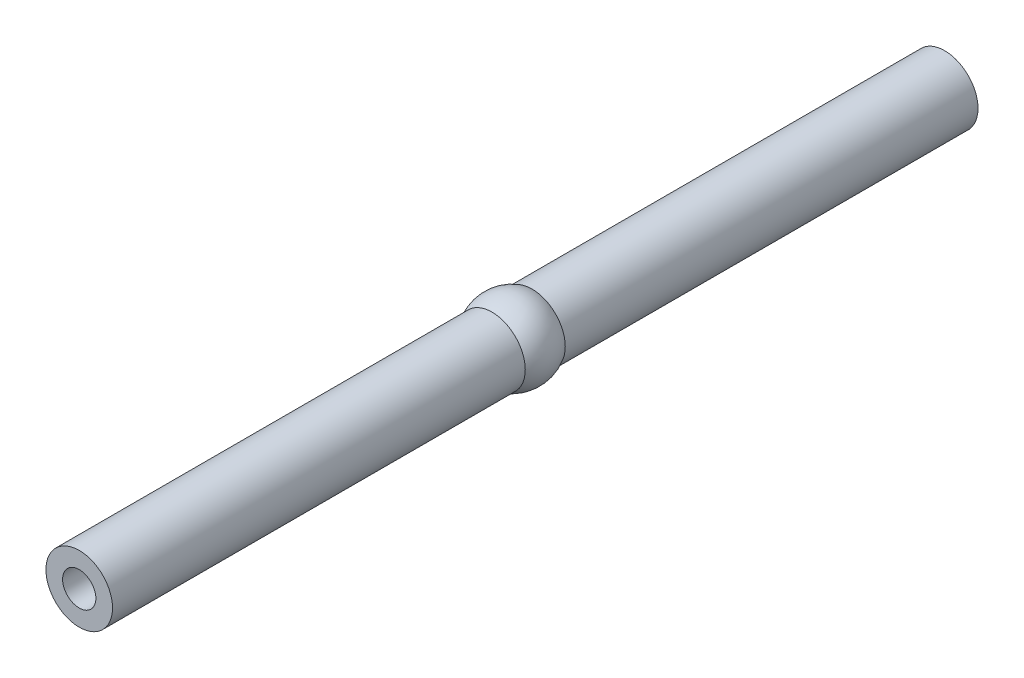
ISO-10303-21;
HEADER;
FILE_DESCRIPTION(('STEP AP214'),'2;1');
FILE_NAME('part.step','',(''),(''),'','','');
FILE_SCHEMA(('AUTOMOTIVE_DESIGN { 1 0 10303 214 1 1 1 1 }'));
ENDSEC;
DATA;
#1=APPLICATION_CONTEXT('core data for automotive mechanical design processes');
#2=APPLICATION_PROTOCOL_DEFINITION('international standard','automotive_design',2000,#1);
#3=PRODUCT_CONTEXT('',#1,'mechanical');
#4=PRODUCT('Part','Part','',(#3));
#5=PRODUCT_RELATED_PRODUCT_CATEGORY('part','',(#4));
#6=PRODUCT_DEFINITION_FORMATION('','',#4);
#7=PRODUCT_DEFINITION_CONTEXT('part definition',#1,'design');
#8=PRODUCT_DEFINITION('design','',#6,#7);
#9=PRODUCT_DEFINITION_SHAPE('','',#8);
#10=(LENGTH_UNIT() NAMED_UNIT(*) SI_UNIT(.MILLI.,.METRE.));
#11=(NAMED_UNIT(*) PLANE_ANGLE_UNIT() SI_UNIT($,.RADIAN.));
#12=(NAMED_UNIT(*) SI_UNIT($,.STERADIAN.) SOLID_ANGLE_UNIT());
#13=UNCERTAINTY_MEASURE_WITH_UNIT(LENGTH_MEASURE(1.E-05),#10,'distance_accuracy_value','');
#14=(GEOMETRIC_REPRESENTATION_CONTEXT(3) GLOBAL_UNCERTAINTY_ASSIGNED_CONTEXT((#13)) GLOBAL_UNIT_ASSIGNED_CONTEXT((#10,
#11,#12)) REPRESENTATION_CONTEXT('',''));
#15=CARTESIAN_POINT('',(0.,0.,0.));
#16=DIRECTION('',(0.,0.,1.));
#17=DIRECTION('',(1.,0.,0.));
#18=AXIS2_PLACEMENT_3D('',#15,#16,#17);
#19=CARTESIAN_POINT('',(0.,0.,39.));
#20=DIRECTION('',(0.,0.,-1.));
#21=DIRECTION('',(-1.,0.,0.));
#22=AXIS2_PLACEMENT_3D('',#19,#20,#21);
#23=CYLINDRICAL_SURFACE('',#22,3.);
#24=CARTESIAN_POINT('',(0.,0.,-39.));
#25=DIRECTION('',(0.,0.,1.));
#26=DIRECTION('',(1.,0.,0.));
#27=AXIS2_PLACEMENT_3D('',#24,#25,#26);
#28=CIRCLE('',#27,3.);
#29=CARTESIAN_POINT('',(3.,0.,-39.));
#30=VERTEX_POINT('',#29);
#31=EDGE_CURVE('E47',#30,#30,#28,.T.);
#32=ORIENTED_EDGE('',*,*,#31,.T.);
#33=EDGE_LOOP('',(#32));
#34=FACE_BOUND('',#33,.T.);
#35=CARTESIAN_POINT('',(0.,0.,-1.802775637732));
#36=DIRECTION('',(0.,0.,1.));
#37=DIRECTION('',(1.,0.,0.));
#38=AXIS2_PLACEMENT_3D('',#35,#36,#37);
#39=CIRCLE('',#38,3.);
#40=CARTESIAN_POINT('',(3.,0.,-1.802775637732));
#41=VERTEX_POINT('',#40);
#42=EDGE_CURVE('E10',#41,#41,#39,.T.);
#43=ORIENTED_EDGE('',*,*,#42,.F.);
#44=EDGE_LOOP('',(#43));
#45=FACE_BOUND('',#44,.T.);
#46=ADVANCED_FACE('F33',(#34,#45),#23,.T.);
#47=CARTESIAN_POINT('',(0.,0.,-39.));
#48=DIRECTION('',(0.,0.,1.));
#49=DIRECTION('',(1.,0.,0.));
#50=AXIS2_PLACEMENT_3D('',#47,#48,#49);
#51=PLANE('',#50);
#52=ORIENTED_EDGE('',*,*,#31,.F.);
#53=EDGE_LOOP('',(#52));
#54=FACE_BOUND('',#53,.T.);
#55=CARTESIAN_POINT('',(0.,0.,-39.));
#56=DIRECTION('',(0.,0.,1.));
#57=DIRECTION('',(1.,0.,0.));
#58=AXIS2_PLACEMENT_3D('',#55,#56,#57);
#59=CIRCLE('',#58,1.5);
#60=CARTESIAN_POINT('',(1.5,0.,-39.));
#61=VERTEX_POINT('',#60);
#62=EDGE_CURVE('E61',#61,#61,#59,.T.);
#63=ORIENTED_EDGE('',*,*,#62,.T.);
#64=EDGE_LOOP('',(#63));
#65=FACE_BOUND('',#64,.T.);
#66=ADVANCED_FACE('F65',(#54,#65),#51,.F.);
#67=CARTESIAN_POINT('',(0.,0.,-29.));
#68=DIRECTION('',(0.,0.,-1.));
#69=DIRECTION('',(-1.,0.,0.));
#70=AXIS2_PLACEMENT_3D('',#67,#68,#69);
#71=CYLINDRICAL_SURFACE('',#70,1.5);
#72=CARTESIAN_POINT('',(0.,0.,-29.));
#73=DIRECTION('',(0.,0.,1.));
#74=DIRECTION('',(1.,0.,0.));
#75=AXIS2_PLACEMENT_3D('',#72,#73,#74);
#76=CIRCLE('',#75,1.5);
#77=CARTESIAN_POINT('',(1.5,0.,-29.));
#78=VERTEX_POINT('',#77);
#79=EDGE_CURVE('E58',#78,#78,#76,.T.);
#80=ORIENTED_EDGE('',*,*,#79,.T.);
#81=EDGE_LOOP('',(#80));
#82=FACE_BOUND('',#81,.T.);
#83=ORIENTED_EDGE('',*,*,#62,.F.);
#84=EDGE_LOOP('',(#83));
#85=FACE_BOUND('',#84,.T.);
#86=ADVANCED_FACE('F67',(#82,#85),#71,.F.);
#87=CARTESIAN_POINT('',(0.,0.,-29.));
#88=DIRECTION('',(0.,0.,-1.));
#89=DIRECTION('',(1.,0.,0.));
#90=AXIS2_PLACEMENT_3D('',#87,#88,#89);
#91=PLANE('',#90);
#92=ORIENTED_EDGE('',*,*,#79,.F.);
#93=EDGE_LOOP('',(#92));
#94=FACE_BOUND('',#93,.T.);
#95=ADVANCED_FACE('F69',(#94),#91,.T.);
#96=CARTESIAN_POINT('',(0.,0.,0.));
#97=DIRECTION('',(0.,0.,-1.));
#98=DIRECTION('',(1.,0.,0.));
#99=AXIS2_PLACEMENT_3D('',#96,#97,#98);
#100=SPHERICAL_SURFACE('',#99,3.5);
#101=CARTESIAN_POINT('',(0.,0.,1.802775637732));
#102=DIRECTION('',(0.,0.,-1.));
#103=DIRECTION('',(-1.,0.,0.));
#104=AXIS2_PLACEMENT_3D('',#101,#102,#103);
#105=CIRCLE('',#104,3.);
#106=CARTESIAN_POINT('',(3.,0.,1.802775637732));
#107=VERTEX_POINT('',#106);
#108=EDGE_CURVE('E39',#107,#107,#105,.T.);
#109=CARTESIAN_POINT('',(3.,0.,1.802775637732));
#110=CARTESIAN_POINT('',(3.02032276109282,0.,1.76895705072467));
#111=CARTESIAN_POINT('',(3.0400731999107,0.,1.73479455955507));
#112=CARTESIAN_POINT('',(3.0784078982649,0.,1.66582142159716));
#113=CARTESIAN_POINT('',(3.09699215780121,0.,1.63101077480884));
#114=CARTESIAN_POINT('',(3.13297296286061,0.,1.56078097831934));
#115=CARTESIAN_POINT('',(3.1503695083837,0.,1.52536182861815));
#116=CARTESIAN_POINT('',(3.18395506629843,0.,1.45395557350236));
#117=CARTESIAN_POINT('',(3.20014407869009,0.,1.41796846808777));
#118=CARTESIAN_POINT('',(3.23129603640389,0.,1.34546744503921));
#119=CARTESIAN_POINT('',(3.24625898172604,0.,1.30895352740524));
#120=CARTESIAN_POINT('',(3.27494169914558,0.,1.2354406401324));
#121=CARTESIAN_POINT('',(3.28866147124297,0.,1.19844167049353));
#122=CARTESIAN_POINT('',(3.31484215087211,0.,1.12400099030846));
#123=CARTESIAN_POINT('',(3.32730305840386,0.,1.08655927976226));
#124=CARTESIAN_POINT('',(3.35095175903643,0.,1.01127593620098));
#125=CARTESIAN_POINT('',(3.36213955213726,0.,0.973434303185896));
#126=CARTESIAN_POINT('',(3.38322922947876,0.,0.897394390201076));
#127=CARTESIAN_POINT('',(3.39313111371944,0.,0.859196110231334));
#128=CARTESIAN_POINT('',(3.41163764960502,0.,0.782486586785238));
#129=CARTESIAN_POINT('',(3.42024230124992,0.,0.743975343308883));
#130=CARTESIAN_POINT('',(3.43614453168395,0.,0.666683934181992));
#131=CARTESIAN_POINT('',(3.44344211047309,0.,0.627903768531457));
#132=CARTESIAN_POINT('',(3.45672184970951,0.,0.550118863932466));
#133=CARTESIAN_POINT('',(3.4627040101568,0.,0.511114124984011));
#134=CARTESIAN_POINT('',(3.47334607152918,0.,0.432924679485344));
#135=CARTESIAN_POINT('',(3.47800597245426,0.,0.393739972935131));
#136=CARTESIAN_POINT('',(3.48599818573437,0.,0.315235403739871));
#137=CARTESIAN_POINT('',(3.48933049808939,0.,0.275915541094823));
#138=CARTESIAN_POINT('',(3.49466372340743,0.,0.197185625780798));
#139=CARTESIAN_POINT('',(3.49666463637044,0.,0.157775573111821));
#140=CARTESIAN_POINT('',(3.49933277466673,0.,0.078910346961896));
#141=CARTESIAN_POINT('',(3.5,0.,0.039455173480948));
#142=CARTESIAN_POINT('',(3.5,0.,-0.039455173480948));
#143=CARTESIAN_POINT('',(3.49933277466673,0.,-0.078910346961896));
#144=CARTESIAN_POINT('',(3.49666463637044,0.,-0.157775573111821));
#145=CARTESIAN_POINT('',(3.49466372340743,0.,-0.197185625780798));
#146=CARTESIAN_POINT('',(3.48933049808939,0.,-0.275915541094823));
#147=CARTESIAN_POINT('',(3.48599818573437,0.,-0.315235403739871));
#148=CARTESIAN_POINT('',(3.47800597245426,0.,-0.393739972935131));
#149=CARTESIAN_POINT('',(3.47334607152918,0.,-0.432924679485344));
#150=CARTESIAN_POINT('',(3.4627040101568,0.,-0.511114124984011));
#151=CARTESIAN_POINT('',(3.45672184970951,0.,-0.550118863932467));
#152=CARTESIAN_POINT('',(3.44344211047309,0.,-0.627903768531457));
#153=CARTESIAN_POINT('',(3.43614453168395,0.,-0.666683934181992));
#154=CARTESIAN_POINT('',(3.42024230124992,0.,-0.743975343308883));
#155=CARTESIAN_POINT('',(3.41163764960502,0.,-0.782486586785238));
#156=CARTESIAN_POINT('',(3.39313111371944,0.,-0.859196110231334));
#157=CARTESIAN_POINT('',(3.38322922947876,0.,-0.897394390201076));
#158=CARTESIAN_POINT('',(3.36213955213726,0.,-0.973434303185896));
#159=CARTESIAN_POINT('',(3.35095175903643,0.,-1.01127593620098));
#160=CARTESIAN_POINT('',(3.32730305840386,0.,-1.08655927976226));
#161=CARTESIAN_POINT('',(3.31484215087211,0.,-1.12400099030846));
#162=CARTESIAN_POINT('',(3.28866147124297,0.,-1.19844167049353));
#163=CARTESIAN_POINT('',(3.27494169914558,0.,-1.2354406401324));
#164=CARTESIAN_POINT('',(3.24625898172604,0.,-1.30895352740524));
#165=CARTESIAN_POINT('',(3.23129603640389,0.,-1.34546744503921));
#166=CARTESIAN_POINT('',(3.20014407869009,0.,-1.41796846808777));
#167=CARTESIAN_POINT('',(3.18395506629843,0.,-1.45395557350236));
#168=CARTESIAN_POINT('',(3.1503695083837,0.,-1.52536182861815));
#169=CARTESIAN_POINT('',(3.13297296286061,0.,-1.56078097831934));
#170=CARTESIAN_POINT('',(3.09699215780121,0.,-1.63101077480884));
#171=CARTESIAN_POINT('',(3.0784078982649,0.,-1.66582142159716));
#172=CARTESIAN_POINT('',(3.0400731999107,0.,-1.73479455955507));
#173=CARTESIAN_POINT('',(3.02032276109282,0.,-1.76895705072467));
#174=CARTESIAN_POINT('',(3.,0.,-1.802775637732));
#175=B_SPLINE_CURVE_WITH_KNOTS('',3,(#109,#110,#111,#112,#113,#114,#115,#116,#117,#118,#119,
#120,#121,#122,#123,#124,#125,#126,#127,#128,#129,#130,#131,#132,#133,#134,#135,#136,#137,#138,
#139,#140,#141,#142,#143,#144,#145,#146,#147,#148,#149,#150,#151,#152,#153,#154,#155,#156,#157,
#158,#159,#160,#161,#162,#163,#164,#165,#166,#167,#168,#169,#170,#171,#172,#173,#174),
.UNSPECIFIED.,.F.,.F.,(4,2,2,2,2,2,2,2,2,2,2,2,2,2,2,2,2,2,2,2,2,2,2,2,2,2,2,2,2,2,2,2,4),(0.,
0.118359880744646,0.236719761489292,0.355079642233938,0.473439522978584,0.59179940372323,
0.710159284467876,0.828519165212522,0.946879045957168,1.06523892670181,1.18359880744646,
1.30195868819111,1.42031856893575,1.5386784496804,1.65703833042504,1.77539821116969,
1.89375809191434,2.01211797265898,2.13047785340363,2.24883773414827,2.36719761489292,
2.48555749563757,2.60391737638221,2.72227725712686,2.8406371378715,2.95899701861615,
3.0773568993608,3.19571678010544,3.31407666085009,3.43243654159473,3.55079642233938,
3.66915630308403,3.78751618382867),.UNSPECIFIED.);
#176=EDGE_CURVE('BSEAM76',#107,#41,#175,.T.);
#177=ORIENTED_EDGE('',*,*,#108,.T.);
#178=ORIENTED_EDGE('',*,*,#42,.T.);
#179=ORIENTED_EDGE('',*,*,#176,.T.);
#180=ORIENTED_EDGE('',*,*,#176,.F.);
#181=EDGE_LOOP('',(#177,#179,#178,#180));
#182=FACE_BOUND('',#181,.T.);
#183=ADVANCED_FACE('F76',(#182),#100,.T.);
#184=CARTESIAN_POINT('',(0.,0.,29.));
#185=DIRECTION('',(0.,0.,1.));
#186=DIRECTION('',(1.,0.,0.));
#187=AXIS2_PLACEMENT_3D('',#184,#185,#186);
#188=PLANE('',#187);
#189=CARTESIAN_POINT('',(0.,0.,29.));
#190=DIRECTION('',(0.,0.,1.));
#191=DIRECTION('',(1.,0.,0.));
#192=AXIS2_PLACEMENT_3D('',#189,#190,#191);
#193=CIRCLE('',#192,1.5);
#194=CARTESIAN_POINT('',(1.5,0.,29.));
#195=VERTEX_POINT('',#194);
#196=EDGE_CURVE('E52',#195,#195,#193,.T.);
#197=ORIENTED_EDGE('',*,*,#196,.T.);
#198=EDGE_LOOP('',(#197));
#199=FACE_BOUND('',#198,.T.);
#200=ADVANCED_FACE('F102',(#199),#188,.T.);
#201=CARTESIAN_POINT('',(0.,0.,29.));
#202=DIRECTION('',(0.,0.,1.));
#203=DIRECTION('',(1.,0.,0.));
#204=AXIS2_PLACEMENT_3D('',#201,#202,#203);
#205=CYLINDRICAL_SURFACE('',#204,1.5);
#206=ORIENTED_EDGE('',*,*,#196,.F.);
#207=EDGE_LOOP('',(#206));
#208=FACE_BOUND('',#207,.T.);
#209=CARTESIAN_POINT('',(0.,0.,39.));
#210=DIRECTION('',(0.,0.,1.));
#211=DIRECTION('',(1.,0.,0.));
#212=AXIS2_PLACEMENT_3D('',#209,#210,#211);
#213=CIRCLE('',#212,1.5);
#214=CARTESIAN_POINT('',(1.5,0.,39.));
#215=VERTEX_POINT('',#214);
#216=EDGE_CURVE('E55',#215,#215,#213,.T.);
#217=ORIENTED_EDGE('',*,*,#216,.T.);
#218=EDGE_LOOP('',(#217));
#219=FACE_BOUND('',#218,.T.);
#220=ADVANCED_FACE('F94',(#208,#219),#205,.F.);
#221=CARTESIAN_POINT('',(0.,0.,39.));
#222=DIRECTION('',(0.,0.,1.));
#223=DIRECTION('',(1.,0.,0.));
#224=AXIS2_PLACEMENT_3D('',#221,#222,#223);
#225=PLANE('',#224);
#226=ORIENTED_EDGE('',*,*,#216,.F.);
#227=EDGE_LOOP('',(#226));
#228=FACE_BOUND('',#227,.T.);
#229=CARTESIAN_POINT('',(0.,0.,39.));
#230=DIRECTION('',(0.,0.,1.));
#231=DIRECTION('',(1.,0.,0.));
#232=AXIS2_PLACEMENT_3D('',#229,#230,#231);
#233=CIRCLE('',#232,3.);
#234=CARTESIAN_POINT('',(3.,0.,39.));
#235=VERTEX_POINT('',#234);
#236=EDGE_CURVE('E43',#235,#235,#233,.T.);
#237=ORIENTED_EDGE('',*,*,#236,.T.);
#238=EDGE_LOOP('',(#237));
#239=FACE_BOUND('',#238,.T.);
#240=ADVANCED_FACE('F89',(#228,#239),#225,.T.);
#241=ORIENTED_EDGE('',*,*,#236,.F.);
#242=EDGE_LOOP('',(#241));
#243=FACE_BOUND('',#242,.T.);
#244=ORIENTED_EDGE('',*,*,#108,.F.);
#245=EDGE_LOOP('',(#244));
#246=FACE_BOUND('',#245,.T.);
#247=ADVANCED_FACE('F84',(#243,#246),#23,.T.);
#248=CLOSED_SHELL('',(#46,#66,#86,#95,#183,#200,#220,#240,#247));
#249=MANIFOLD_SOLID_BREP('B2',#248);
#250=ADVANCED_BREP_SHAPE_REPRESENTATION('',(#18,#249),#14);
#251=SHAPE_DEFINITION_REPRESENTATION(#9,#250);
ENDSEC;
END-ISO-10303-21;
